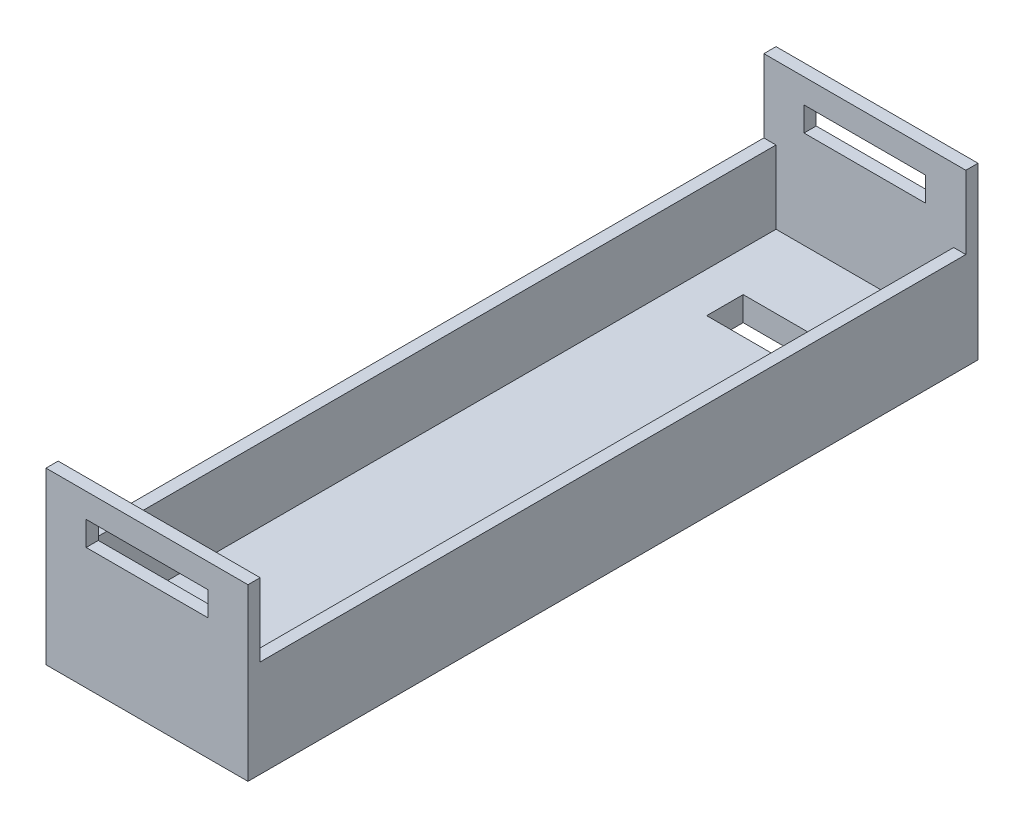
ISO-10303-21;
HEADER;
FILE_DESCRIPTION(('STEP AP214'),'2;1');
FILE_NAME('part.step','',(''),(''),'','','');
FILE_SCHEMA(('AUTOMOTIVE_DESIGN { 1 0 10303 214 1 1 1 1 }'));
ENDSEC;
DATA;
#1=APPLICATION_CONTEXT('core data for automotive mechanical design processes');
#2=APPLICATION_PROTOCOL_DEFINITION('international standard','automotive_design',2000,#1);
#3=PRODUCT_CONTEXT('',#1,'mechanical');
#4=PRODUCT('Part','Part','',(#3));
#5=PRODUCT_RELATED_PRODUCT_CATEGORY('part','',(#4));
#6=PRODUCT_DEFINITION_FORMATION('','',#4);
#7=PRODUCT_DEFINITION_CONTEXT('part definition',#1,'design');
#8=PRODUCT_DEFINITION('design','',#6,#7);
#9=PRODUCT_DEFINITION_SHAPE('','',#8);
#10=(LENGTH_UNIT() NAMED_UNIT(*) SI_UNIT(.MILLI.,.METRE.));
#11=(NAMED_UNIT(*) PLANE_ANGLE_UNIT() SI_UNIT($,.RADIAN.));
#12=(NAMED_UNIT(*) SI_UNIT($,.STERADIAN.) SOLID_ANGLE_UNIT());
#13=UNCERTAINTY_MEASURE_WITH_UNIT(LENGTH_MEASURE(1.E-05),#10,'distance_accuracy_value','');
#14=(GEOMETRIC_REPRESENTATION_CONTEXT(3) GLOBAL_UNCERTAINTY_ASSIGNED_CONTEXT((#13)) GLOBAL_UNIT_ASSIGNED_CONTEXT((#10,
#11,#12)) REPRESENTATION_CONTEXT('',''));
#15=CARTESIAN_POINT('',(0.,0.,0.));
#16=DIRECTION('',(0.,0.,1.));
#17=DIRECTION('',(1.,0.,0.));
#18=AXIS2_PLACEMENT_3D('',#15,#16,#17);
#19=CARTESIAN_POINT('',(41.5,35.,150.));
#20=DIRECTION('',(0.,-1.,0.));
#21=DIRECTION('',(1.,0.,0.));
#22=AXIS2_PLACEMENT_3D('',#19,#20,#21);
#23=PLANE('',#22);
#24=DIRECTION('',(0.,0.,-1.));
#25=VECTOR('',#24,1.);
#26=CARTESIAN_POINT('',(-41.5,35.,150.));
#27=LINE('',#26,#25);
#28=CARTESIAN_POINT('',(-41.5,35.,-145.));
#29=VERTEX_POINT('',#28);
#30=CARTESIAN_POINT('',(-41.5,35.,-150.));
#31=VERTEX_POINT('',#30);
#32=EDGE_CURVE('E354',#29,#31,#27,.T.);
#33=ORIENTED_EDGE('',*,*,#32,.F.);
#34=DIRECTION('',(-1.,0.,0.));
#35=VECTOR('',#34,1.);
#36=CARTESIAN_POINT('',(36.5,35.,-145.));
#37=LINE('',#36,#35);
#38=CARTESIAN_POINT('',(41.5,35.,-145.));
#39=VERTEX_POINT('',#38);
#40=EDGE_CURVE('E315',#39,#29,#37,.T.);
#41=ORIENTED_EDGE('',*,*,#40,.F.);
#42=DIRECTION('',(0.,0.,-1.));
#43=VECTOR('',#42,1.);
#44=CARTESIAN_POINT('',(41.5,35.,150.));
#45=LINE('',#44,#43);
#46=CARTESIAN_POINT('',(41.5,35.,-150.));
#47=VERTEX_POINT('',#46);
#48=EDGE_CURVE('E367',#39,#47,#45,.T.);
#49=ORIENTED_EDGE('',*,*,#48,.T.);
#50=DIRECTION('',(-1.,0.,0.));
#51=VECTOR('',#50,1.);
#52=CARTESIAN_POINT('',(41.5,35.,-150.));
#53=LINE('',#52,#51);
#54=EDGE_CURVE('E348',#47,#31,#53,.T.);
#55=ORIENTED_EDGE('',*,*,#54,.T.);
#56=EDGE_LOOP('',(#33,#41,#49,#55));
#57=FACE_BOUND('',#56,.T.);
#58=ADVANCED_FACE('F39',(#57),#23,.F.);
#59=CARTESIAN_POINT('',(-41.5,-35.,150.));
#60=DIRECTION('',(1.,0.,0.));
#61=DIRECTION('',(0.,0.,-1.));
#62=AXIS2_PLACEMENT_3D('',#59,#60,#61);
#63=PLANE('',#62);
#64=DIRECTION('',(0.,0.,1.));
#65=VECTOR('',#64,1.);
#66=CARTESIAN_POINT('',(-41.5,5.,-145.));
#67=LINE('',#66,#65);
#68=CARTESIAN_POINT('',(-41.5,5.,-145.));
#69=VERTEX_POINT('',#68);
#70=CARTESIAN_POINT('',(-41.5,5.,145.));
#71=VERTEX_POINT('',#70);
#72=EDGE_CURVE('E288',#69,#71,#67,.T.);
#73=ORIENTED_EDGE('',*,*,#72,.F.);
#74=DIRECTION('',(0.,-1.,0.));
#75=VECTOR('',#74,1.);
#76=CARTESIAN_POINT('',(-41.5,35.,-145.));
#77=LINE('',#76,#75);
#78=EDGE_CURVE('E285',#29,#69,#77,.T.);
#79=ORIENTED_EDGE('',*,*,#78,.F.);
#80=ORIENTED_EDGE('',*,*,#32,.T.);
#81=DIRECTION('',(0.,-1.,0.));
#82=VECTOR('',#81,1.);
#83=CARTESIAN_POINT('',(-41.5,-35.,-150.));
#84=LINE('',#83,#82);
#85=CARTESIAN_POINT('',(-41.5,-35.,-150.));
#86=VERTEX_POINT('',#85);
#87=EDGE_CURVE('E335',#31,#86,#84,.T.);
#88=ORIENTED_EDGE('',*,*,#87,.T.);
#89=DIRECTION('',(0.,0.,-1.));
#90=VECTOR('',#89,1.);
#91=CARTESIAN_POINT('',(-41.5,-35.,150.));
#92=LINE('',#91,#90);
#93=CARTESIAN_POINT('',(-41.5,-35.,150.));
#94=VERTEX_POINT('',#93);
#95=EDGE_CURVE('E374',#94,#86,#92,.T.);
#96=ORIENTED_EDGE('',*,*,#95,.F.);
#97=DIRECTION('',(0.,-1.,0.));
#98=VECTOR('',#97,1.);
#99=CARTESIAN_POINT('',(-41.5,-35.,150.));
#100=LINE('',#99,#98);
#101=CARTESIAN_POINT('',(-41.5,35.,150.));
#102=VERTEX_POINT('',#101);
#103=EDGE_CURVE('E344',#102,#94,#100,.T.);
#104=ORIENTED_EDGE('',*,*,#103,.F.);
#105=CARTESIAN_POINT('',(-41.5,35.,145.));
#106=VERTEX_POINT('',#105);
#107=EDGE_CURVE('E364',#102,#106,#27,.T.);
#108=ORIENTED_EDGE('',*,*,#107,.T.);
#109=DIRECTION('',(0.,1.,0.));
#110=VECTOR('',#109,1.);
#111=CARTESIAN_POINT('',(-41.5,35.,145.));
#112=LINE('',#111,#110);
#113=EDGE_CURVE('E291',#71,#106,#112,.T.);
#114=ORIENTED_EDGE('',*,*,#113,.F.);
#115=EDGE_LOOP('',(#73,#79,#80,#88,#96,#104,#108,#114));
#116=FACE_BOUND('',#115,.T.);
#117=ADVANCED_FACE('F41',(#116),#63,.F.);
#118=CARTESIAN_POINT('',(41.5,-35.,150.));
#119=DIRECTION('',(0.,1.,0.));
#120=DIRECTION('',(-1.,0.,0.));
#121=AXIS2_PLACEMENT_3D('',#118,#119,#120);
#122=PLANE('',#121);
#123=DIRECTION('',(1.,0.,0.));
#124=VECTOR('',#123,1.);
#125=CARTESIAN_POINT('',(41.5,-35.,-100.));
#126=LINE('',#125,#124);
#127=CARTESIAN_POINT('',(-20.,-35.,-100.));
#128=VERTEX_POINT('',#127);
#129=CARTESIAN_POINT('',(20.,-35.,-100.));
#130=VERTEX_POINT('',#129);
#131=EDGE_CURVE('E231',#128,#130,#126,.T.);
#132=ORIENTED_EDGE('',*,*,#131,.T.);
#133=DIRECTION('',(0.,0.,-1.));
#134=VECTOR('',#133,1.);
#135=CARTESIAN_POINT('',(20.0000000000001,-35.,150.));
#136=LINE('',#135,#134);
#137=CARTESIAN_POINT('',(20.,-35.,-115.));
#138=VERTEX_POINT('',#137);
#139=EDGE_CURVE('E234',#130,#138,#136,.T.);
#140=ORIENTED_EDGE('',*,*,#139,.T.);
#141=DIRECTION('',(-1.,0.,0.));
#142=VECTOR('',#141,1.);
#143=CARTESIAN_POINT('',(41.5,-35.,-115.));
#144=LINE('',#143,#142);
#145=CARTESIAN_POINT('',(-20.,-35.,-115.));
#146=VERTEX_POINT('',#145);
#147=EDGE_CURVE('E226',#138,#146,#144,.T.);
#148=ORIENTED_EDGE('',*,*,#147,.T.);
#149=DIRECTION('',(0.,0.,1.));
#150=VECTOR('',#149,1.);
#151=CARTESIAN_POINT('',(-20.,-35.,150.));
#152=LINE('',#151,#150);
#153=EDGE_CURVE('E206',#146,#128,#152,.T.);
#154=ORIENTED_EDGE('',*,*,#153,.T.);
#155=EDGE_LOOP('',(#132,#140,#148,#154));
#156=FACE_BOUND('',#155,.T.);
#157=DIRECTION('',(1.,0.,0.));
#158=VECTOR('',#157,1.);
#159=CARTESIAN_POINT('',(41.5,-35.,-150.));
#160=LINE('',#159,#158);
#161=CARTESIAN_POINT('',(41.5,-35.,-150.));
#162=VERTEX_POINT('',#161);
#163=EDGE_CURVE('E357',#86,#162,#160,.T.);
#164=ORIENTED_EDGE('',*,*,#163,.T.);
#165=DIRECTION('',(0.,0.,-1.));
#166=VECTOR('',#165,1.);
#167=CARTESIAN_POINT('',(41.5,-35.,150.));
#168=LINE('',#167,#166);
#169=CARTESIAN_POINT('',(41.5,-35.,150.));
#170=VERTEX_POINT('',#169);
#171=EDGE_CURVE('E371',#170,#162,#168,.T.);
#172=ORIENTED_EDGE('',*,*,#171,.F.);
#173=DIRECTION('',(1.,0.,0.));
#174=VECTOR('',#173,1.);
#175=CARTESIAN_POINT('',(41.5,-35.,150.));
#176=LINE('',#175,#174);
#177=EDGE_CURVE('E347',#94,#170,#176,.T.);
#178=ORIENTED_EDGE('',*,*,#177,.F.);
#179=ORIENTED_EDGE('',*,*,#95,.T.);
#180=EDGE_LOOP('',(#164,#172,#178,#179));
#181=FACE_BOUND('',#180,.T.);
#182=ADVANCED_FACE('F430',(#156,#181),#122,.F.);
#183=CARTESIAN_POINT('',(41.5,-35.,150.));
#184=DIRECTION('',(-1.,0.,0.));
#185=DIRECTION('',(0.,0.,1.));
#186=AXIS2_PLACEMENT_3D('',#183,#184,#185);
#187=PLANE('',#186);
#188=ORIENTED_EDGE('',*,*,#48,.F.);
#189=DIRECTION('',(0.,-1.,0.));
#190=VECTOR('',#189,1.);
#191=CARTESIAN_POINT('',(41.5,-35.,-145.));
#192=LINE('',#191,#190);
#193=CARTESIAN_POINT('',(41.5,5.,-145.));
#194=VERTEX_POINT('',#193);
#195=EDGE_CURVE('E312',#39,#194,#192,.T.);
#196=ORIENTED_EDGE('',*,*,#195,.T.);
#197=DIRECTION('',(0.,0.,1.));
#198=VECTOR('',#197,1.);
#199=CARTESIAN_POINT('',(41.5,5.,150.));
#200=LINE('',#199,#198);
#201=CARTESIAN_POINT('',(41.5,5.,145.));
#202=VERTEX_POINT('',#201);
#203=EDGE_CURVE('E306',#194,#202,#200,.T.);
#204=ORIENTED_EDGE('',*,*,#203,.T.);
#205=DIRECTION('',(0.,1.,0.));
#206=VECTOR('',#205,1.);
#207=CARTESIAN_POINT('',(41.5,-35.,145.));
#208=LINE('',#207,#206);
#209=CARTESIAN_POINT('',(41.5,35.,145.));
#210=VERTEX_POINT('',#209);
#211=EDGE_CURVE('E309',#202,#210,#208,.T.);
#212=ORIENTED_EDGE('',*,*,#211,.T.);
#213=CARTESIAN_POINT('',(41.5,35.,150.));
#214=VERTEX_POINT('',#213);
#215=EDGE_CURVE('E368',#214,#210,#45,.T.);
#216=ORIENTED_EDGE('',*,*,#215,.F.);
#217=DIRECTION('',(0.,1.,0.));
#218=VECTOR('',#217,1.);
#219=CARTESIAN_POINT('',(41.5,-35.,150.));
#220=LINE('',#219,#218);
#221=EDGE_CURVE('E350',#170,#214,#220,.T.);
#222=ORIENTED_EDGE('',*,*,#221,.F.);
#223=ORIENTED_EDGE('',*,*,#171,.T.);
#224=DIRECTION('',(0.,1.,0.));
#225=VECTOR('',#224,1.);
#226=CARTESIAN_POINT('',(41.5,-35.,-150.));
#227=LINE('',#226,#225);
#228=EDGE_CURVE('E359',#162,#47,#227,.T.);
#229=ORIENTED_EDGE('',*,*,#228,.T.);
#230=EDGE_LOOP('',(#188,#196,#204,#212,#216,#222,#223,#229));
#231=FACE_BOUND('',#230,.T.);
#232=ADVANCED_FACE('F437',(#231),#187,.F.);
#233=ORIENTED_EDGE('',*,*,#215,.T.);
#234=DIRECTION('',(1.,0.,0.));
#235=VECTOR('',#234,1.);
#236=CARTESIAN_POINT('',(-36.5,35.,145.));
#237=LINE('',#236,#235);
#238=EDGE_CURVE('E320',#106,#210,#237,.T.);
#239=ORIENTED_EDGE('',*,*,#238,.F.);
#240=ORIENTED_EDGE('',*,*,#107,.F.);
#241=DIRECTION('',(-1.,0.,0.));
#242=VECTOR('',#241,1.);
#243=CARTESIAN_POINT('',(41.5,35.,150.));
#244=LINE('',#243,#242);
#245=EDGE_CURVE('E352',#214,#102,#244,.T.);
#246=ORIENTED_EDGE('',*,*,#245,.F.);
#247=EDGE_LOOP('',(#233,#239,#240,#246));
#248=FACE_BOUND('',#247,.T.);
#249=ADVANCED_FACE('F426',(#248),#23,.F.);
#250=CARTESIAN_POINT('',(0.,0.,150.));
#251=DIRECTION('',(0.,0.,1.));
#252=DIRECTION('',(1.,0.,0.));
#253=AXIS2_PLACEMENT_3D('',#250,#251,#252);
#254=PLANE('',#253);
#255=DIRECTION('',(0.,-1.,0.));
#256=VECTOR('',#255,1.);
#257=CARTESIAN_POINT('',(-25.,15.,150.));
#258=LINE('',#257,#256);
#259=CARTESIAN_POINT('',(-25.,25.,150.));
#260=VERTEX_POINT('',#259);
#261=CARTESIAN_POINT('',(-25.,15.,150.));
#262=VERTEX_POINT('',#261);
#263=EDGE_CURVE('E237',#260,#262,#258,.T.);
#264=ORIENTED_EDGE('',*,*,#263,.F.);
#265=DIRECTION('',(-1.,0.,0.));
#266=VECTOR('',#265,1.);
#267=CARTESIAN_POINT('',(-25.,25.,150.));
#268=LINE('',#267,#266);
#269=CARTESIAN_POINT('',(25.,25.,150.));
#270=VERTEX_POINT('',#269);
#271=EDGE_CURVE('E245',#270,#260,#268,.T.);
#272=ORIENTED_EDGE('',*,*,#271,.F.);
#273=DIRECTION('',(0.,1.,0.));
#274=VECTOR('',#273,1.);
#275=CARTESIAN_POINT('',(25.,15.,150.));
#276=LINE('',#275,#274);
#277=CARTESIAN_POINT('',(25.,15.,150.));
#278=VERTEX_POINT('',#277);
#279=EDGE_CURVE('E242',#278,#270,#276,.T.);
#280=ORIENTED_EDGE('',*,*,#279,.F.);
#281=DIRECTION('',(1.,0.,0.));
#282=VECTOR('',#281,1.);
#283=CARTESIAN_POINT('',(-25.,15.,150.));
#284=LINE('',#283,#282);
#285=EDGE_CURVE('E239',#262,#278,#284,.T.);
#286=ORIENTED_EDGE('',*,*,#285,.F.);
#287=EDGE_LOOP('',(#264,#272,#280,#286));
#288=FACE_BOUND('',#287,.T.);
#289=ORIENTED_EDGE('',*,*,#103,.T.);
#290=ORIENTED_EDGE('',*,*,#177,.T.);
#291=ORIENTED_EDGE('',*,*,#221,.T.);
#292=ORIENTED_EDGE('',*,*,#245,.T.);
#293=EDGE_LOOP('',(#289,#290,#291,#292));
#294=FACE_BOUND('',#293,.T.);
#295=ADVANCED_FACE('F436',(#288,#294),#254,.T.);
#296=CARTESIAN_POINT('',(0.,0.,-150.));
#297=DIRECTION('',(0.,0.,1.));
#298=DIRECTION('',(1.,0.,0.));
#299=AXIS2_PLACEMENT_3D('',#296,#297,#298);
#300=PLANE('',#299);
#301=DIRECTION('',(-1.,0.,0.));
#302=VECTOR('',#301,1.);
#303=CARTESIAN_POINT('',(0.,25.,-150.));
#304=LINE('',#303,#302);
#305=CARTESIAN_POINT('',(25.,25.,-150.));
#306=VERTEX_POINT('',#305);
#307=CARTESIAN_POINT('',(-25.,25.,-150.));
#308=VERTEX_POINT('',#307);
#309=EDGE_CURVE('E276',#306,#308,#304,.T.);
#310=ORIENTED_EDGE('',*,*,#309,.T.);
#311=DIRECTION('',(0.,-1.,0.));
#312=VECTOR('',#311,1.);
#313=CARTESIAN_POINT('',(-25.,0.,-150.));
#314=LINE('',#313,#312);
#315=CARTESIAN_POINT('',(-25.,15.,-150.));
#316=VERTEX_POINT('',#315);
#317=EDGE_CURVE('E282',#308,#316,#314,.T.);
#318=ORIENTED_EDGE('',*,*,#317,.T.);
#319=DIRECTION('',(1.,0.,0.));
#320=VECTOR('',#319,1.);
#321=CARTESIAN_POINT('',(0.,15.,-150.));
#322=LINE('',#321,#320);
#323=CARTESIAN_POINT('',(25.,15.,-150.));
#324=VERTEX_POINT('',#323);
#325=EDGE_CURVE('E264',#316,#324,#322,.T.);
#326=ORIENTED_EDGE('',*,*,#325,.T.);
#327=DIRECTION('',(0.,1.,0.));
#328=VECTOR('',#327,1.);
#329=CARTESIAN_POINT('',(25.,0.,-150.));
#330=LINE('',#329,#328);
#331=EDGE_CURVE('E270',#324,#306,#330,.T.);
#332=ORIENTED_EDGE('',*,*,#331,.T.);
#333=EDGE_LOOP('',(#310,#318,#326,#332));
#334=FACE_BOUND('',#333,.T.);
#335=ORIENTED_EDGE('',*,*,#87,.F.);
#336=ORIENTED_EDGE('',*,*,#54,.F.);
#337=ORIENTED_EDGE('',*,*,#228,.F.);
#338=ORIENTED_EDGE('',*,*,#163,.F.);
#339=EDGE_LOOP('',(#335,#336,#337,#338));
#340=FACE_BOUND('',#339,.T.);
#341=ADVANCED_FACE('F397',(#334,#340),#300,.F.);
#342=CARTESIAN_POINT('',(36.5,-25.,145.));
#343=DIRECTION('',(1.,0.,0.));
#344=DIRECTION('',(0.,1.,0.));
#345=AXIS2_PLACEMENT_3D('',#342,#343,#344);
#346=PLANE('',#345);
#347=DIRECTION('',(0.,1.,0.));
#348=VECTOR('',#347,1.);
#349=CARTESIAN_POINT('',(36.5,-25.,145.));
#350=LINE('',#349,#348);
#351=CARTESIAN_POINT('',(36.5,-25.,145.));
#352=VERTEX_POINT('',#351);
#353=CARTESIAN_POINT('',(36.5,5.,145.));
#354=VERTEX_POINT('',#353);
#355=EDGE_CURVE('E332',#352,#354,#350,.T.);
#356=ORIENTED_EDGE('',*,*,#355,.T.);
#357=DIRECTION('',(0.,0.,-1.));
#358=VECTOR('',#357,1.);
#359=CARTESIAN_POINT('',(36.5,5.,145.));
#360=LINE('',#359,#358);
#361=CARTESIAN_POINT('',(36.5,5.,-145.));
#362=VERTEX_POINT('',#361);
#363=EDGE_CURVE('E303',#354,#362,#360,.T.);
#364=ORIENTED_EDGE('',*,*,#363,.T.);
#365=DIRECTION('',(0.,1.,0.));
#366=VECTOR('',#365,1.);
#367=CARTESIAN_POINT('',(36.5,-25.,-145.));
#368=LINE('',#367,#366);
#369=CARTESIAN_POINT('',(36.5,-25.,-145.));
#370=VERTEX_POINT('',#369);
#371=EDGE_CURVE('E329',#370,#362,#368,.T.);
#372=ORIENTED_EDGE('',*,*,#371,.F.);
#373=DIRECTION('',(0.,0.,-1.));
#374=VECTOR('',#373,1.);
#375=CARTESIAN_POINT('',(36.5,-25.,145.));
#376=LINE('',#375,#374);
#377=EDGE_CURVE('E316',#352,#370,#376,.T.);
#378=ORIENTED_EDGE('',*,*,#377,.F.);
#379=EDGE_LOOP('',(#356,#364,#372,#378));
#380=FACE_BOUND('',#379,.T.);
#381=ADVANCED_FACE('F458',(#380),#346,.F.);
#382=CARTESIAN_POINT('',(-36.5,-25.,145.));
#383=DIRECTION('',(0.,0.,1.));
#384=DIRECTION('',(1.,0.,0.));
#385=AXIS2_PLACEMENT_3D('',#382,#383,#384);
#386=PLANE('',#385);
#387=DIRECTION('',(-1.,0.,0.));
#388=VECTOR('',#387,1.);
#389=CARTESIAN_POINT('',(-36.5,25.,145.));
#390=LINE('',#389,#388);
#391=CARTESIAN_POINT('',(25.,25.,145.));
#392=VERTEX_POINT('',#391);
#393=CARTESIAN_POINT('',(-25.,25.,145.));
#394=VERTEX_POINT('',#393);
#395=EDGE_CURVE('E273',#392,#394,#390,.T.);
#396=ORIENTED_EDGE('',*,*,#395,.T.);
#397=DIRECTION('',(0.,-1.,0.));
#398=VECTOR('',#397,1.);
#399=CARTESIAN_POINT('',(-25.,-25.,145.));
#400=LINE('',#399,#398);
#401=CARTESIAN_POINT('',(-25.,15.,145.));
#402=VERTEX_POINT('',#401);
#403=EDGE_CURVE('E279',#394,#402,#400,.T.);
#404=ORIENTED_EDGE('',*,*,#403,.T.);
#405=DIRECTION('',(1.,0.,0.));
#406=VECTOR('',#405,1.);
#407=CARTESIAN_POINT('',(-36.5,15.,145.));
#408=LINE('',#407,#406);
#409=CARTESIAN_POINT('',(25.,15.,145.));
#410=VERTEX_POINT('',#409);
#411=EDGE_CURVE('E261',#402,#410,#408,.T.);
#412=ORIENTED_EDGE('',*,*,#411,.T.);
#413=DIRECTION('',(0.,1.,0.));
#414=VECTOR('',#413,1.);
#415=CARTESIAN_POINT('',(25.,-25.,145.));
#416=LINE('',#415,#414);
#417=EDGE_CURVE('E267',#410,#392,#416,.T.);
#418=ORIENTED_EDGE('',*,*,#417,.T.);
#419=EDGE_LOOP('',(#396,#404,#412,#418));
#420=FACE_BOUND('',#419,.T.);
#421=DIRECTION('',(0.,1.,0.));
#422=VECTOR('',#421,1.);
#423=CARTESIAN_POINT('',(-36.5,-25.,145.));
#424=LINE('',#423,#422);
#425=CARTESIAN_POINT('',(-36.5,-25.,145.));
#426=VERTEX_POINT('',#425);
#427=CARTESIAN_POINT('',(-36.5,5.,145.));
#428=VERTEX_POINT('',#427);
#429=EDGE_CURVE('E336',#426,#428,#424,.T.);
#430=ORIENTED_EDGE('',*,*,#429,.T.);
#431=DIRECTION('',(-1.,0.,0.));
#432=VECTOR('',#431,1.);
#433=CARTESIAN_POINT('',(67.5,5.,145.));
#434=LINE('',#433,#432);
#435=EDGE_CURVE('E295',#428,#71,#434,.T.);
#436=ORIENTED_EDGE('',*,*,#435,.T.);
#437=ORIENTED_EDGE('',*,*,#113,.T.);
#438=ORIENTED_EDGE('',*,*,#238,.T.);
#439=ORIENTED_EDGE('',*,*,#211,.F.);
#440=EDGE_CURVE('E297',#202,#354,#434,.T.);
#441=ORIENTED_EDGE('',*,*,#440,.T.);
#442=ORIENTED_EDGE('',*,*,#355,.F.);
#443=DIRECTION('',(1.,0.,0.));
#444=VECTOR('',#443,1.);
#445=CARTESIAN_POINT('',(-36.5,-25.,145.));
#446=LINE('',#445,#444);
#447=EDGE_CURVE('E326',#426,#352,#446,.T.);
#448=ORIENTED_EDGE('',*,*,#447,.F.);
#449=EDGE_LOOP('',(#430,#436,#437,#438,#439,#441,#442,#448));
#450=FACE_BOUND('',#449,.T.);
#451=ADVANCED_FACE('F455',(#420,#450),#386,.F.);
#452=CARTESIAN_POINT('',(-36.5,-25.,-145.));
#453=DIRECTION('',(-1.,0.,0.));
#454=DIRECTION('',(0.,-1.,0.));
#455=AXIS2_PLACEMENT_3D('',#452,#453,#454);
#456=PLANE('',#455);
#457=DIRECTION('',(0.,1.,0.));
#458=VECTOR('',#457,1.);
#459=CARTESIAN_POINT('',(-36.5,-25.,-145.));
#460=LINE('',#459,#458);
#461=CARTESIAN_POINT('',(-36.5,-25.,-145.));
#462=VERTEX_POINT('',#461);
#463=CARTESIAN_POINT('',(-36.5,5.,-145.));
#464=VERTEX_POINT('',#463);
#465=EDGE_CURVE('E339',#462,#464,#460,.T.);
#466=ORIENTED_EDGE('',*,*,#465,.T.);
#467=DIRECTION('',(0.,0.,1.));
#468=VECTOR('',#467,1.);
#469=CARTESIAN_POINT('',(-36.5,5.,-145.));
#470=LINE('',#469,#468);
#471=EDGE_CURVE('E300',#464,#428,#470,.T.);
#472=ORIENTED_EDGE('',*,*,#471,.T.);
#473=ORIENTED_EDGE('',*,*,#429,.F.);
#474=DIRECTION('',(0.,0.,1.));
#475=VECTOR('',#474,1.);
#476=CARTESIAN_POINT('',(-36.5,-25.,-145.));
#477=LINE('',#476,#475);
#478=EDGE_CURVE('E323',#462,#426,#477,.T.);
#479=ORIENTED_EDGE('',*,*,#478,.F.);
#480=EDGE_LOOP('',(#466,#472,#473,#479));
#481=FACE_BOUND('',#480,.T.);
#482=ADVANCED_FACE('F466',(#481),#456,.F.);
#483=CARTESIAN_POINT('',(36.5,-25.,-145.));
#484=DIRECTION('',(0.,0.,-1.));
#485=DIRECTION('',(-1.,0.,0.));
#486=AXIS2_PLACEMENT_3D('',#483,#484,#485);
#487=PLANE('',#486);
#488=DIRECTION('',(-1.,0.,0.));
#489=VECTOR('',#488,1.);
#490=CARTESIAN_POINT('',(36.5,15.,-145.));
#491=LINE('',#490,#489);
#492=CARTESIAN_POINT('',(25.,15.,-145.));
#493=VERTEX_POINT('',#492);
#494=CARTESIAN_POINT('',(-25.,15.,-145.));
#495=VERTEX_POINT('',#494);
#496=EDGE_CURVE('E377',#493,#495,#491,.T.);
#497=ORIENTED_EDGE('',*,*,#496,.T.);
#498=DIRECTION('',(0.,1.,0.));
#499=VECTOR('',#498,1.);
#500=CARTESIAN_POINT('',(-25.,-25.,-145.));
#501=LINE('',#500,#499);
#502=CARTESIAN_POINT('',(-25.,25.,-145.));
#503=VERTEX_POINT('',#502);
#504=EDGE_CURVE('E11',#495,#503,#501,.T.);
#505=ORIENTED_EDGE('',*,*,#504,.T.);
#506=DIRECTION('',(1.,0.,0.));
#507=VECTOR('',#506,1.);
#508=CARTESIAN_POINT('',(36.5,25.,-145.));
#509=LINE('',#508,#507);
#510=CARTESIAN_POINT('',(25.,25.,-145.));
#511=VERTEX_POINT('',#510);
#512=EDGE_CURVE('E47',#503,#511,#509,.T.);
#513=ORIENTED_EDGE('',*,*,#512,.T.);
#514=DIRECTION('',(0.,-1.,0.));
#515=VECTOR('',#514,1.);
#516=CARTESIAN_POINT('',(25.,-25.,-145.));
#517=LINE('',#516,#515);
#518=EDGE_CURVE('E380',#511,#493,#517,.T.);
#519=ORIENTED_EDGE('',*,*,#518,.T.);
#520=EDGE_LOOP('',(#497,#505,#513,#519));
#521=FACE_BOUND('',#520,.T.);
#522=ORIENTED_EDGE('',*,*,#371,.T.);
#523=DIRECTION('',(-1.,0.,0.));
#524=VECTOR('',#523,1.);
#525=CARTESIAN_POINT('',(67.5,5.,-145.));
#526=LINE('',#525,#524);
#527=EDGE_CURVE('E298',#194,#362,#526,.T.);
#528=ORIENTED_EDGE('',*,*,#527,.F.);
#529=ORIENTED_EDGE('',*,*,#195,.F.);
#530=ORIENTED_EDGE('',*,*,#40,.T.);
#531=ORIENTED_EDGE('',*,*,#78,.T.);
#532=EDGE_CURVE('E294',#464,#69,#526,.T.);
#533=ORIENTED_EDGE('',*,*,#532,.F.);
#534=ORIENTED_EDGE('',*,*,#465,.F.);
#535=DIRECTION('',(-1.,0.,0.));
#536=VECTOR('',#535,1.);
#537=CARTESIAN_POINT('',(36.5,-25.,-145.));
#538=LINE('',#537,#536);
#539=EDGE_CURVE('E319',#370,#462,#538,.T.);
#540=ORIENTED_EDGE('',*,*,#539,.F.);
#541=EDGE_LOOP('',(#522,#528,#529,#530,#531,#533,#534,#540));
#542=FACE_BOUND('',#541,.T.);
#543=ADVANCED_FACE('F384',(#521,#542),#487,.F.);
#544=CARTESIAN_POINT('',(0.,-25.,0.));
#545=DIRECTION('',(0.,1.,0.));
#546=DIRECTION('',(-1.,0.,0.));
#547=AXIS2_PLACEMENT_3D('',#544,#545,#546);
#548=PLANE('',#547);
#549=DIRECTION('',(0.,0.,-1.));
#550=VECTOR('',#549,1.);
#551=CARTESIAN_POINT('',(20.,-25.,-115.));
#552=LINE('',#551,#550);
#553=CARTESIAN_POINT('',(20.,-25.,-100.));
#554=VERTEX_POINT('',#553);
#555=CARTESIAN_POINT('',(20.,-25.,-115.));
#556=VERTEX_POINT('',#555);
#557=EDGE_CURVE('E62',#554,#556,#552,.T.);
#558=ORIENTED_EDGE('',*,*,#557,.F.);
#559=DIRECTION('',(1.,0.,0.));
#560=VECTOR('',#559,1.);
#561=CARTESIAN_POINT('',(-20.,-25.,-100.));
#562=LINE('',#561,#560);
#563=CARTESIAN_POINT('',(-20.,-25.,-100.));
#564=VERTEX_POINT('',#563);
#565=EDGE_CURVE('E219',#564,#554,#562,.T.);
#566=ORIENTED_EDGE('',*,*,#565,.F.);
#567=DIRECTION('',(0.,0.,1.));
#568=VECTOR('',#567,1.);
#569=CARTESIAN_POINT('',(-20.,-25.,-115.));
#570=LINE('',#569,#568);
#571=CARTESIAN_POINT('',(-20.,-25.,-115.));
#572=VERTEX_POINT('',#571);
#573=EDGE_CURVE('E203',#572,#564,#570,.T.);
#574=ORIENTED_EDGE('',*,*,#573,.F.);
#575=DIRECTION('',(-1.,0.,0.));
#576=VECTOR('',#575,1.);
#577=CARTESIAN_POINT('',(-20.,-25.,-115.));
#578=LINE('',#577,#576);
#579=EDGE_CURVE('E212',#556,#572,#578,.T.);
#580=ORIENTED_EDGE('',*,*,#579,.F.);
#581=EDGE_LOOP('',(#558,#566,#574,#580));
#582=FACE_BOUND('',#581,.T.);
#583=ORIENTED_EDGE('',*,*,#377,.T.);
#584=ORIENTED_EDGE('',*,*,#539,.T.);
#585=ORIENTED_EDGE('',*,*,#478,.T.);
#586=ORIENTED_EDGE('',*,*,#447,.T.);
#587=EDGE_LOOP('',(#583,#584,#585,#586));
#588=FACE_BOUND('',#587,.T.);
#589=ADVANCED_FACE('F216',(#582,#588),#548,.T.);
#590=CARTESIAN_POINT('',(67.5,5.,-145.));
#591=DIRECTION('',(0.,-1.,0.));
#592=DIRECTION('',(0.,0.,-1.));
#593=AXIS2_PLACEMENT_3D('',#590,#591,#592);
#594=PLANE('',#593);
#595=ORIENTED_EDGE('',*,*,#532,.T.);
#596=ORIENTED_EDGE('',*,*,#72,.T.);
#597=ORIENTED_EDGE('',*,*,#435,.F.);
#598=ORIENTED_EDGE('',*,*,#471,.F.);
#599=EDGE_LOOP('',(#595,#596,#597,#598));
#600=FACE_BOUND('',#599,.T.);
#601=ADVANCED_FACE('F416',(#600),#594,.F.);
#602=ORIENTED_EDGE('',*,*,#527,.T.);
#603=ORIENTED_EDGE('',*,*,#363,.F.);
#604=ORIENTED_EDGE('',*,*,#440,.F.);
#605=ORIENTED_EDGE('',*,*,#203,.F.);
#606=EDGE_LOOP('',(#602,#603,#604,#605));
#607=FACE_BOUND('',#606,.T.);
#608=ADVANCED_FACE('F406',(#607),#594,.F.);
#609=CARTESIAN_POINT('',(-25.,15.,-193.));
#610=DIRECTION('',(0.,-1.,0.));
#611=DIRECTION('',(0.,0.,-1.));
#612=AXIS2_PLACEMENT_3D('',#609,#610,#611);
#613=PLANE('',#612);
#614=DIRECTION('',(0.,0.,1.));
#615=VECTOR('',#614,1.);
#616=CARTESIAN_POINT('',(-25.,15.,-193.));
#617=LINE('',#616,#615);
#618=EDGE_CURVE('E258',#316,#495,#617,.T.);
#619=ORIENTED_EDGE('',*,*,#618,.T.);
#620=ORIENTED_EDGE('',*,*,#496,.F.);
#621=DIRECTION('',(0.,0.,1.));
#622=VECTOR('',#621,1.);
#623=CARTESIAN_POINT('',(25.,15.,-193.));
#624=LINE('',#623,#622);
#625=EDGE_CURVE('E255',#324,#493,#624,.T.);
#626=ORIENTED_EDGE('',*,*,#625,.F.);
#627=ORIENTED_EDGE('',*,*,#325,.F.);
#628=EDGE_LOOP('',(#619,#620,#626,#627));
#629=FACE_BOUND('',#628,.T.);
#630=ADVANCED_FACE('F404',(#629),#613,.F.);
#631=CARTESIAN_POINT('',(25.,15.,-193.));
#632=DIRECTION('',(1.,0.,0.));
#633=DIRECTION('',(0.,0.,-1.));
#634=AXIS2_PLACEMENT_3D('',#631,#632,#633);
#635=PLANE('',#634);
#636=ORIENTED_EDGE('',*,*,#625,.T.);
#637=ORIENTED_EDGE('',*,*,#518,.F.);
#638=DIRECTION('',(0.,0.,1.));
#639=VECTOR('',#638,1.);
#640=CARTESIAN_POINT('',(25.,25.,-193.));
#641=LINE('',#640,#639);
#642=EDGE_CURVE('E252',#306,#511,#641,.T.);
#643=ORIENTED_EDGE('',*,*,#642,.F.);
#644=ORIENTED_EDGE('',*,*,#331,.F.);
#645=EDGE_LOOP('',(#636,#637,#643,#644));
#646=FACE_BOUND('',#645,.T.);
#647=ADVANCED_FACE('F402',(#646),#635,.F.);
#648=CARTESIAN_POINT('',(-25.,25.,-193.));
#649=DIRECTION('',(0.,1.,0.));
#650=DIRECTION('',(-1.,0.,0.));
#651=AXIS2_PLACEMENT_3D('',#648,#649,#650);
#652=PLANE('',#651);
#653=ORIENTED_EDGE('',*,*,#642,.T.);
#654=ORIENTED_EDGE('',*,*,#512,.F.);
#655=DIRECTION('',(0.,0.,1.));
#656=VECTOR('',#655,1.);
#657=CARTESIAN_POINT('',(-25.,25.,-193.));
#658=LINE('',#657,#656);
#659=EDGE_CURVE('E251',#308,#503,#658,.T.);
#660=ORIENTED_EDGE('',*,*,#659,.F.);
#661=ORIENTED_EDGE('',*,*,#309,.F.);
#662=EDGE_LOOP('',(#653,#654,#660,#661));
#663=FACE_BOUND('',#662,.T.);
#664=ADVANCED_FACE('F391',(#663),#652,.F.);
#665=CARTESIAN_POINT('',(-25.,15.,-193.));
#666=DIRECTION('',(-1.,0.,0.));
#667=DIRECTION('',(0.,0.,1.));
#668=AXIS2_PLACEMENT_3D('',#665,#666,#667);
#669=PLANE('',#668);
#670=ORIENTED_EDGE('',*,*,#659,.T.);
#671=ORIENTED_EDGE('',*,*,#504,.F.);
#672=ORIENTED_EDGE('',*,*,#618,.F.);
#673=ORIENTED_EDGE('',*,*,#317,.F.);
#674=EDGE_LOOP('',(#670,#671,#672,#673));
#675=FACE_BOUND('',#674,.T.);
#676=ADVANCED_FACE('F394',(#675),#669,.F.);
#677=EDGE_CURVE('E249',#394,#260,#658,.T.);
#678=ORIENTED_EDGE('',*,*,#677,.T.);
#679=ORIENTED_EDGE('',*,*,#263,.T.);
#680=EDGE_CURVE('E248',#402,#262,#617,.T.);
#681=ORIENTED_EDGE('',*,*,#680,.F.);
#682=ORIENTED_EDGE('',*,*,#403,.F.);
#683=EDGE_LOOP('',(#678,#679,#681,#682));
#684=FACE_BOUND('',#683,.T.);
#685=ADVANCED_FACE('F492',(#684),#669,.F.);
#686=EDGE_CURVE('E253',#392,#270,#641,.T.);
#687=ORIENTED_EDGE('',*,*,#686,.T.);
#688=ORIENTED_EDGE('',*,*,#271,.T.);
#689=ORIENTED_EDGE('',*,*,#677,.F.);
#690=ORIENTED_EDGE('',*,*,#395,.F.);
#691=EDGE_LOOP('',(#687,#688,#689,#690));
#692=FACE_BOUND('',#691,.T.);
#693=ADVANCED_FACE('F497',(#692),#652,.F.);
#694=EDGE_CURVE('E256',#410,#278,#624,.T.);
#695=ORIENTED_EDGE('',*,*,#694,.T.);
#696=ORIENTED_EDGE('',*,*,#279,.T.);
#697=ORIENTED_EDGE('',*,*,#686,.F.);
#698=ORIENTED_EDGE('',*,*,#417,.F.);
#699=EDGE_LOOP('',(#695,#696,#697,#698));
#700=FACE_BOUND('',#699,.T.);
#701=ADVANCED_FACE('F414',(#700),#635,.F.);
#702=ORIENTED_EDGE('',*,*,#680,.T.);
#703=ORIENTED_EDGE('',*,*,#285,.T.);
#704=ORIENTED_EDGE('',*,*,#694,.F.);
#705=ORIENTED_EDGE('',*,*,#411,.F.);
#706=EDGE_LOOP('',(#702,#703,#704,#705));
#707=FACE_BOUND('',#706,.T.);
#708=ADVANCED_FACE('F408',(#707),#613,.F.);
#709=CARTESIAN_POINT('',(20.,-368.,-115.));
#710=DIRECTION('',(1.,0.,0.));
#711=DIRECTION('',(0.,0.,-1.));
#712=AXIS2_PLACEMENT_3D('',#709,#710,#711);
#713=PLANE('',#712);
#714=DIRECTION('',(0.,1.,0.));
#715=VECTOR('',#714,1.);
#716=CARTESIAN_POINT('',(20.0000000000001,-368.,-100.));
#717=LINE('',#716,#715);
#718=EDGE_CURVE('E224',#130,#554,#717,.T.);
#719=ORIENTED_EDGE('',*,*,#718,.T.);
#720=ORIENTED_EDGE('',*,*,#557,.T.);
#721=DIRECTION('',(0.,1.,0.));
#722=VECTOR('',#721,1.);
#723=CARTESIAN_POINT('',(20.,-368.,-115.));
#724=LINE('',#723,#722);
#725=EDGE_CURVE('E209',#138,#556,#724,.T.);
#726=ORIENTED_EDGE('',*,*,#725,.F.);
#727=ORIENTED_EDGE('',*,*,#139,.F.);
#728=EDGE_LOOP('',(#719,#720,#726,#727));
#729=FACE_BOUND('',#728,.T.);
#730=ADVANCED_FACE('F421',(#729),#713,.F.);
#731=CARTESIAN_POINT('',(-20.,-368.,-100.));
#732=DIRECTION('',(0.,0.,1.));
#733=DIRECTION('',(1.,0.,0.));
#734=AXIS2_PLACEMENT_3D('',#731,#732,#733);
#735=PLANE('',#734);
#736=DIRECTION('',(0.,1.,0.));
#737=VECTOR('',#736,1.);
#738=CARTESIAN_POINT('',(-20.,-368.,-100.));
#739=LINE('',#738,#737);
#740=EDGE_CURVE('E208',#128,#564,#739,.T.);
#741=ORIENTED_EDGE('',*,*,#740,.T.);
#742=ORIENTED_EDGE('',*,*,#565,.T.);
#743=ORIENTED_EDGE('',*,*,#718,.F.);
#744=ORIENTED_EDGE('',*,*,#131,.F.);
#745=EDGE_LOOP('',(#741,#742,#743,#744));
#746=FACE_BOUND('',#745,.T.);
#747=ADVANCED_FACE('F547',(#746),#735,.F.);
#748=CARTESIAN_POINT('',(-20.,-368.,-115.));
#749=DIRECTION('',(-1.,0.,0.));
#750=DIRECTION('',(0.,0.,1.));
#751=AXIS2_PLACEMENT_3D('',#748,#749,#750);
#752=PLANE('',#751);
#753=DIRECTION('',(0.,1.,0.));
#754=VECTOR('',#753,1.);
#755=CARTESIAN_POINT('',(-20.,-368.,-115.));
#756=LINE('',#755,#754);
#757=EDGE_CURVE('E54',#146,#572,#756,.T.);
#758=ORIENTED_EDGE('',*,*,#757,.T.);
#759=ORIENTED_EDGE('',*,*,#573,.T.);
#760=ORIENTED_EDGE('',*,*,#740,.F.);
#761=ORIENTED_EDGE('',*,*,#153,.F.);
#762=EDGE_LOOP('',(#758,#759,#760,#761));
#763=FACE_BOUND('',#762,.T.);
#764=ADVANCED_FACE('F200',(#763),#752,.F.);
#765=CARTESIAN_POINT('',(-20.,-368.,-115.));
#766=DIRECTION('',(0.,0.,-1.));
#767=DIRECTION('',(-1.,0.,0.));
#768=AXIS2_PLACEMENT_3D('',#765,#766,#767);
#769=PLANE('',#768);
#770=ORIENTED_EDGE('',*,*,#725,.T.);
#771=ORIENTED_EDGE('',*,*,#579,.T.);
#772=ORIENTED_EDGE('',*,*,#757,.F.);
#773=ORIENTED_EDGE('',*,*,#147,.F.);
#774=EDGE_LOOP('',(#770,#771,#772,#773));
#775=FACE_BOUND('',#774,.T.);
#776=ADVANCED_FACE('F213',(#775),#769,.F.);
#777=CLOSED_SHELL('',(#58,#117,#182,#232,#249,#295,#341,#381,#451,#482,#543,#589,#601,#608,#630,
#647,#664,#676,#685,#693,#701,#708,#730,#747,#764,#776));
#778=MANIFOLD_SOLID_BREP('B2',#777);
#779=ADVANCED_BREP_SHAPE_REPRESENTATION('',(#18,#778),#14);
#780=SHAPE_DEFINITION_REPRESENTATION(#9,#779);
ENDSEC;
END-ISO-10303-21;
